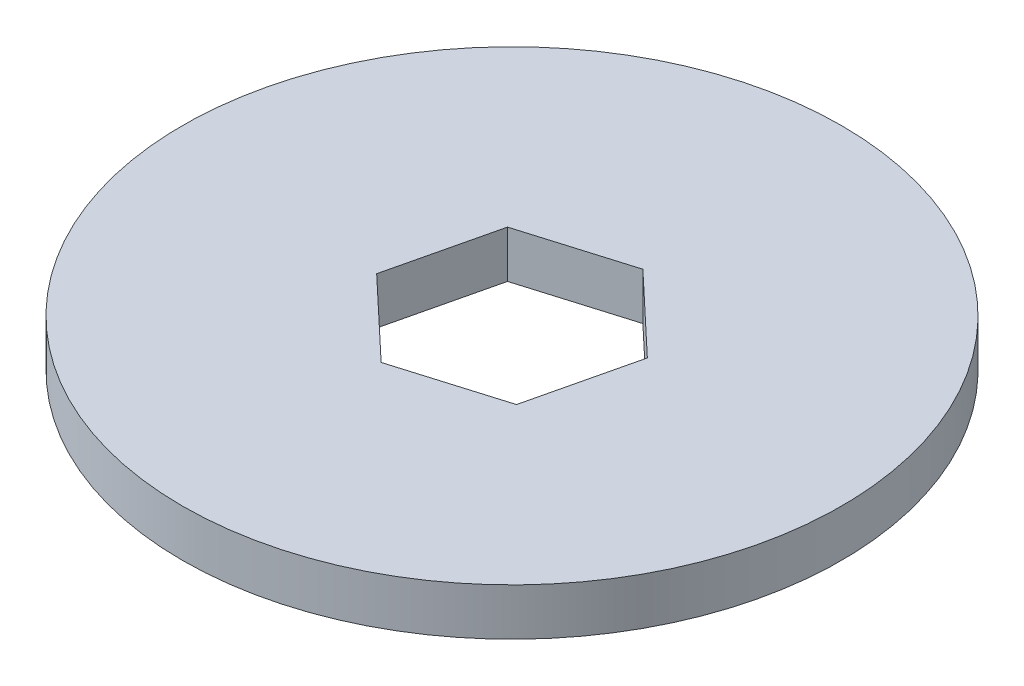
ISO-10303-21;
HEADER;
FILE_DESCRIPTION(('STEP AP214'),'2;1');
FILE_NAME('part.step','',(''),(''),'','','');
FILE_SCHEMA(('AUTOMOTIVE_DESIGN { 1 0 10303 214 1 1 1 1 }'));
ENDSEC;
DATA;
#1=APPLICATION_CONTEXT('core data for automotive mechanical design processes');
#2=APPLICATION_PROTOCOL_DEFINITION('international standard','automotive_design',2000,#1);
#3=PRODUCT_CONTEXT('',#1,'mechanical');
#4=PRODUCT('Part','Part','',(#3));
#5=PRODUCT_RELATED_PRODUCT_CATEGORY('part','',(#4));
#6=PRODUCT_DEFINITION_FORMATION('','',#4);
#7=PRODUCT_DEFINITION_CONTEXT('part definition',#1,'design');
#8=PRODUCT_DEFINITION('design','',#6,#7);
#9=PRODUCT_DEFINITION_SHAPE('','',#8);
#10=(LENGTH_UNIT() NAMED_UNIT(*) SI_UNIT(.MILLI.,.METRE.));
#11=(NAMED_UNIT(*) PLANE_ANGLE_UNIT() SI_UNIT($,.RADIAN.));
#12=(NAMED_UNIT(*) SI_UNIT($,.STERADIAN.) SOLID_ANGLE_UNIT());
#13=UNCERTAINTY_MEASURE_WITH_UNIT(LENGTH_MEASURE(1.E-05),#10,'distance_accuracy_value','');
#14=(GEOMETRIC_REPRESENTATION_CONTEXT(3) GLOBAL_UNCERTAINTY_ASSIGNED_CONTEXT((#13)) GLOBAL_UNIT_ASSIGNED_CONTEXT((#10,
#11,#12)) REPRESENTATION_CONTEXT('',''));
#15=CARTESIAN_POINT('',(0.,0.,0.));
#16=DIRECTION('',(0.,0.,1.));
#17=DIRECTION('',(1.,0.,0.));
#18=AXIS2_PLACEMENT_3D('',#15,#16,#17);
#19=CARTESIAN_POINT('',(0.,3.175,0.));
#20=DIRECTION('',(0.,1.,0.));
#21=DIRECTION('',(0.,0.,1.));
#22=AXIS2_PLACEMENT_3D('',#19,#20,#21);
#23=PLANE('',#22);
#24=CARTESIAN_POINT('',(0.,3.175,0.));
#25=DIRECTION('',(0.,1.,0.));
#26=DIRECTION('',(0.,0.,1.));
#27=AXIS2_PLACEMENT_3D('',#24,#25,#26);
#28=CIRCLE('',#27,22.225);
#29=CARTESIAN_POINT('',(0.,3.175,22.225));
#30=VERTEX_POINT('',#29);
#31=EDGE_CURVE('E11',#30,#30,#28,.T.);
#32=ORIENTED_EDGE('',*,*,#31,.T.);
#33=EDGE_LOOP('',(#32));
#34=FACE_BOUND('',#33,.T.);
#35=DIRECTION('',(-0.9579773208438,0.,0.286843951912769));
#36=VECTOR('',#35,1.);
#37=CARTESIAN_POINT('',(1.69065265217762,3.175,-7.13477588596994));
#38=LINE('',#37,#36);
#39=CARTESIAN_POINT('',(1.69065265217762,3.175,-7.13477588596994));
#40=VERTEX_POINT('',#39);
#41=CARTESIAN_POINT('',(-5.33357084146978,3.175,-5.03153608874633));
#42=VERTEX_POINT('',#41);
#43=EDGE_CURVE('E98',#40,#42,#38,.T.);
#44=ORIENTED_EDGE('',*,*,#43,.F.);
#45=DIRECTION('',(-0.72740280970028,0.,-0.686210720143702));
#46=VECTOR('',#45,1.);
#47=CARTESIAN_POINT('',(7.0242234936474,3.175,-2.10323979722362));
#48=LINE('',#47,#46);
#49=CARTESIAN_POINT('',(7.0242234936474,3.175,-2.10323979722362));
#50=VERTEX_POINT('',#49);
#51=EDGE_CURVE('E90',#50,#40,#48,.T.);
#52=ORIENTED_EDGE('',*,*,#51,.F.);
#53=DIRECTION('',(0.23057451114352,0.,-0.973054672056471));
#54=VECTOR('',#53,1.);
#55=CARTESIAN_POINT('',(5.33357084146978,3.175,5.03153608874633));
#56=LINE('',#55,#54);
#57=CARTESIAN_POINT('',(5.33357084146978,3.175,5.03153608874633));
#58=VERTEX_POINT('',#57);
#59=EDGE_CURVE('E118',#58,#50,#56,.T.);
#60=ORIENTED_EDGE('',*,*,#59,.F.);
#61=DIRECTION('',(0.9579773208438,0.,-0.286843951912769));
#62=VECTOR('',#61,1.);
#63=CARTESIAN_POINT('',(-1.69065265217761,3.175,7.13477588596994));
#64=LINE('',#63,#62);
#65=CARTESIAN_POINT('',(-1.69065265217761,3.175,7.13477588596994));
#66=VERTEX_POINT('',#65);
#67=EDGE_CURVE('E116',#66,#58,#64,.T.);
#68=ORIENTED_EDGE('',*,*,#67,.F.);
#69=DIRECTION('',(0.72740280970028,0.,0.686210720143702));
#70=VECTOR('',#69,1.);
#71=CARTESIAN_POINT('',(-7.0242234936474,3.175,2.10323979722362));
#72=LINE('',#71,#70);
#73=CARTESIAN_POINT('',(-7.0242234936474,3.175,2.10323979722362));
#74=VERTEX_POINT('',#73);
#75=EDGE_CURVE('E112',#74,#66,#72,.T.);
#76=ORIENTED_EDGE('',*,*,#75,.F.);
#77=DIRECTION('',(-0.23057451114352,0.,0.973054672056471));
#78=VECTOR('',#77,1.);
#79=CARTESIAN_POINT('',(-5.33357084146978,3.175,-5.03153608874633));
#80=LINE('',#79,#78);
#81=EDGE_CURVE('E110',#42,#74,#80,.T.);
#82=ORIENTED_EDGE('',*,*,#81,.F.);
#83=EDGE_LOOP('',(#44,#52,#60,#68,#76,#82));
#84=FACE_BOUND('',#83,.T.);
#85=ADVANCED_FACE('F37',(#34,#84),#23,.T.);
#86=CARTESIAN_POINT('',(0.,0.,0.));
#87=DIRECTION('',(0.,1.,0.));
#88=DIRECTION('',(0.,0.,1.));
#89=AXIS2_PLACEMENT_3D('',#86,#87,#88);
#90=PLANE('',#89);
#91=CARTESIAN_POINT('',(0.,0.,0.));
#92=DIRECTION('',(0.,1.,0.));
#93=DIRECTION('',(0.,0.,1.));
#94=AXIS2_PLACEMENT_3D('',#91,#92,#93);
#95=CIRCLE('',#94,22.225);
#96=CARTESIAN_POINT('',(0.,0.,22.225));
#97=VERTEX_POINT('',#96);
#98=EDGE_CURVE('E41',#97,#97,#95,.T.);
#99=ORIENTED_EDGE('',*,*,#98,.F.);
#100=EDGE_LOOP('',(#99));
#101=FACE_BOUND('',#100,.T.);
#102=DIRECTION('',(-0.72740280970028,0.,-0.686210720143702));
#103=VECTOR('',#102,1.);
#104=CARTESIAN_POINT('',(7.0242234936474,0.,-2.10323979722362));
#105=LINE('',#104,#103);
#106=CARTESIAN_POINT('',(7.0242234936474,0.,-2.10323979722362));
#107=VERTEX_POINT('',#106);
#108=CARTESIAN_POINT('',(1.69065265217762,0.,-7.13477588596994));
#109=VERTEX_POINT('',#108);
#110=EDGE_CURVE('E60',#107,#109,#105,.T.);
#111=ORIENTED_EDGE('',*,*,#110,.T.);
#112=DIRECTION('',(-0.9579773208438,0.,0.286843951912769));
#113=VECTOR('',#112,1.);
#114=CARTESIAN_POINT('',(1.69065265217762,0.,-7.13477588596994));
#115=LINE('',#114,#113);
#116=CARTESIAN_POINT('',(-5.33357084146978,0.,-5.03153608874633));
#117=VERTEX_POINT('',#116);
#118=EDGE_CURVE('E105',#109,#117,#115,.T.);
#119=ORIENTED_EDGE('',*,*,#118,.T.);
#120=DIRECTION('',(-0.23057451114352,0.,0.973054672056471));
#121=VECTOR('',#120,1.);
#122=CARTESIAN_POINT('',(-5.33357084146978,0.,-5.03153608874633));
#123=LINE('',#122,#121);
#124=CARTESIAN_POINT('',(-7.0242234936474,0.,2.10323979722362));
#125=VERTEX_POINT('',#124);
#126=EDGE_CURVE('E122',#117,#125,#123,.T.);
#127=ORIENTED_EDGE('',*,*,#126,.T.);
#128=DIRECTION('',(0.72740280970028,0.,0.686210720143702));
#129=VECTOR('',#128,1.);
#130=CARTESIAN_POINT('',(-7.0242234936474,0.,2.10323979722362));
#131=LINE('',#130,#129);
#132=CARTESIAN_POINT('',(-1.69065265217761,0.,7.13477588596994));
#133=VERTEX_POINT('',#132);
#134=EDGE_CURVE('E125',#125,#133,#131,.T.);
#135=ORIENTED_EDGE('',*,*,#134,.T.);
#136=DIRECTION('',(0.9579773208438,0.,-0.286843951912769));
#137=VECTOR('',#136,1.);
#138=CARTESIAN_POINT('',(-1.69065265217761,0.,7.13477588596994));
#139=LINE('',#138,#137);
#140=CARTESIAN_POINT('',(5.33357084146978,0.,5.03153608874633));
#141=VERTEX_POINT('',#140);
#142=EDGE_CURVE('E128',#133,#141,#139,.T.);
#143=ORIENTED_EDGE('',*,*,#142,.T.);
#144=DIRECTION('',(0.23057451114352,0.,-0.973054672056471));
#145=VECTOR('',#144,1.);
#146=CARTESIAN_POINT('',(5.33357084146978,0.,5.03153608874633));
#147=LINE('',#146,#145);
#148=EDGE_CURVE('E99',#141,#107,#147,.T.);
#149=ORIENTED_EDGE('',*,*,#148,.T.);
#150=EDGE_LOOP('',(#111,#119,#127,#135,#143,#149));
#151=FACE_BOUND('',#150,.T.);
#152=ADVANCED_FACE('F145',(#101,#151),#90,.F.);
#153=CARTESIAN_POINT('',(0.,3.175,0.));
#154=DIRECTION('',(0.,-1.,0.));
#155=DIRECTION('',(0.,0.,-1.));
#156=AXIS2_PLACEMENT_3D('',#153,#154,#155);
#157=CYLINDRICAL_SURFACE('',#156,22.225);
#158=ORIENTED_EDGE('',*,*,#31,.F.);
#159=EDGE_LOOP('',(#158));
#160=FACE_BOUND('',#159,.T.);
#161=ORIENTED_EDGE('',*,*,#98,.T.);
#162=EDGE_LOOP('',(#161));
#163=FACE_BOUND('',#162,.T.);
#164=ADVANCED_FACE('F39',(#160,#163),#157,.T.);
#165=CARTESIAN_POINT('',(7.0242234936474,3.175,-2.10323979722362));
#166=DIRECTION('',(-0.686210720143702,0.,0.72740280970028));
#167=DIRECTION('',(0.72740280970028,0.,0.686210720143702));
#168=AXIS2_PLACEMENT_3D('',#165,#166,#167);
#169=PLANE('',#168);
#170=ORIENTED_EDGE('',*,*,#110,.F.);
#171=DIRECTION('',(0.,-1.,0.));
#172=VECTOR('',#171,1.);
#173=CARTESIAN_POINT('',(7.0242234936474,3.175,-2.10323979722362));
#174=LINE('',#173,#172);
#175=EDGE_CURVE('E94',#50,#107,#174,.T.);
#176=ORIENTED_EDGE('',*,*,#175,.F.);
#177=ORIENTED_EDGE('',*,*,#51,.T.);
#178=DIRECTION('',(0.,-1.,0.));
#179=VECTOR('',#178,1.);
#180=CARTESIAN_POINT('',(1.69065265217762,3.175,-7.13477588596994));
#181=LINE('',#180,#179);
#182=EDGE_CURVE('E93',#40,#109,#181,.T.);
#183=ORIENTED_EDGE('',*,*,#182,.T.);
#184=EDGE_LOOP('',(#170,#176,#177,#183));
#185=FACE_BOUND('',#184,.T.);
#186=ADVANCED_FACE('F92',(#185),#169,.T.);
#187=CARTESIAN_POINT('',(1.69065265217762,3.175,-7.13477588596994));
#188=DIRECTION('',(0.286843951912769,0.,0.9579773208438));
#189=DIRECTION('',(0.9579773208438,0.,-0.286843951912769));
#190=AXIS2_PLACEMENT_3D('',#187,#188,#189);
#191=PLANE('',#190);
#192=ORIENTED_EDGE('',*,*,#118,.F.);
#193=ORIENTED_EDGE('',*,*,#182,.F.);
#194=ORIENTED_EDGE('',*,*,#43,.T.);
#195=DIRECTION('',(0.,-1.,0.));
#196=VECTOR('',#195,1.);
#197=CARTESIAN_POINT('',(-5.33357084146978,3.175,-5.03153608874633));
#198=LINE('',#197,#196);
#199=EDGE_CURVE('E106',#42,#117,#198,.T.);
#200=ORIENTED_EDGE('',*,*,#199,.T.);
#201=EDGE_LOOP('',(#192,#193,#194,#200));
#202=FACE_BOUND('',#201,.T.);
#203=ADVANCED_FACE('F102',(#202),#191,.T.);
#204=CARTESIAN_POINT('',(-5.33357084146978,3.175,-5.03153608874633));
#205=DIRECTION('',(0.973054672056471,0.,0.23057451114352));
#206=DIRECTION('',(0.23057451114352,0.,-0.973054672056471));
#207=AXIS2_PLACEMENT_3D('',#204,#205,#206);
#208=PLANE('',#207);
#209=ORIENTED_EDGE('',*,*,#126,.F.);
#210=ORIENTED_EDGE('',*,*,#199,.F.);
#211=ORIENTED_EDGE('',*,*,#81,.T.);
#212=DIRECTION('',(0.,-1.,0.));
#213=VECTOR('',#212,1.);
#214=CARTESIAN_POINT('',(-7.0242234936474,3.175,2.10323979722362));
#215=LINE('',#214,#213);
#216=EDGE_CURVE('E137',#74,#125,#215,.T.);
#217=ORIENTED_EDGE('',*,*,#216,.T.);
#218=EDGE_LOOP('',(#209,#210,#211,#217));
#219=FACE_BOUND('',#218,.T.);
#220=ADVANCED_FACE('F141',(#219),#208,.T.);
#221=CARTESIAN_POINT('',(-7.0242234936474,3.175,2.10323979722362));
#222=DIRECTION('',(0.686210720143702,0.,-0.72740280970028));
#223=DIRECTION('',(-0.72740280970028,0.,-0.686210720143702));
#224=AXIS2_PLACEMENT_3D('',#221,#222,#223);
#225=PLANE('',#224);
#226=ORIENTED_EDGE('',*,*,#134,.F.);
#227=ORIENTED_EDGE('',*,*,#216,.F.);
#228=ORIENTED_EDGE('',*,*,#75,.T.);
#229=DIRECTION('',(0.,-1.,0.));
#230=VECTOR('',#229,1.);
#231=CARTESIAN_POINT('',(-1.69065265217761,3.175,7.13477588596994));
#232=LINE('',#231,#230);
#233=EDGE_CURVE('E135',#66,#133,#232,.T.);
#234=ORIENTED_EDGE('',*,*,#233,.T.);
#235=EDGE_LOOP('',(#226,#227,#228,#234));
#236=FACE_BOUND('',#235,.T.);
#237=ADVANCED_FACE('F153',(#236),#225,.T.);
#238=CARTESIAN_POINT('',(-1.69065265217761,3.175,7.13477588596994));
#239=DIRECTION('',(-0.286843951912769,0.,-0.9579773208438));
#240=DIRECTION('',(-0.9579773208438,0.,0.286843951912769));
#241=AXIS2_PLACEMENT_3D('',#238,#239,#240);
#242=PLANE('',#241);
#243=ORIENTED_EDGE('',*,*,#142,.F.);
#244=ORIENTED_EDGE('',*,*,#233,.F.);
#245=ORIENTED_EDGE('',*,*,#67,.T.);
#246=DIRECTION('',(0.,-1.,0.));
#247=VECTOR('',#246,1.);
#248=CARTESIAN_POINT('',(5.33357084146978,3.175,5.03153608874633));
#249=LINE('',#248,#247);
#250=EDGE_CURVE('E52',#58,#141,#249,.T.);
#251=ORIENTED_EDGE('',*,*,#250,.T.);
#252=EDGE_LOOP('',(#243,#244,#245,#251));
#253=FACE_BOUND('',#252,.T.);
#254=ADVANCED_FACE('F151',(#253),#242,.T.);
#255=CARTESIAN_POINT('',(5.33357084146978,3.175,5.03153608874633));
#256=DIRECTION('',(-0.973054672056471,0.,-0.23057451114352));
#257=DIRECTION('',(-0.23057451114352,0.,0.973054672056471));
#258=AXIS2_PLACEMENT_3D('',#255,#256,#257);
#259=PLANE('',#258);
#260=ORIENTED_EDGE('',*,*,#148,.F.);
#261=ORIENTED_EDGE('',*,*,#250,.F.);
#262=ORIENTED_EDGE('',*,*,#59,.T.);
#263=ORIENTED_EDGE('',*,*,#175,.T.);
#264=EDGE_LOOP('',(#260,#261,#262,#263));
#265=FACE_BOUND('',#264,.T.);
#266=ADVANCED_FACE('F147',(#265),#259,.T.);
#267=CLOSED_SHELL('',(#85,#152,#164,#186,#203,#220,#237,#254,#266));
#268=MANIFOLD_SOLID_BREP('B2',#267);
#269=ADVANCED_BREP_SHAPE_REPRESENTATION('',(#18,#268),#14);
#270=SHAPE_DEFINITION_REPRESENTATION(#9,#269);
ENDSEC;
END-ISO-10303-21;
